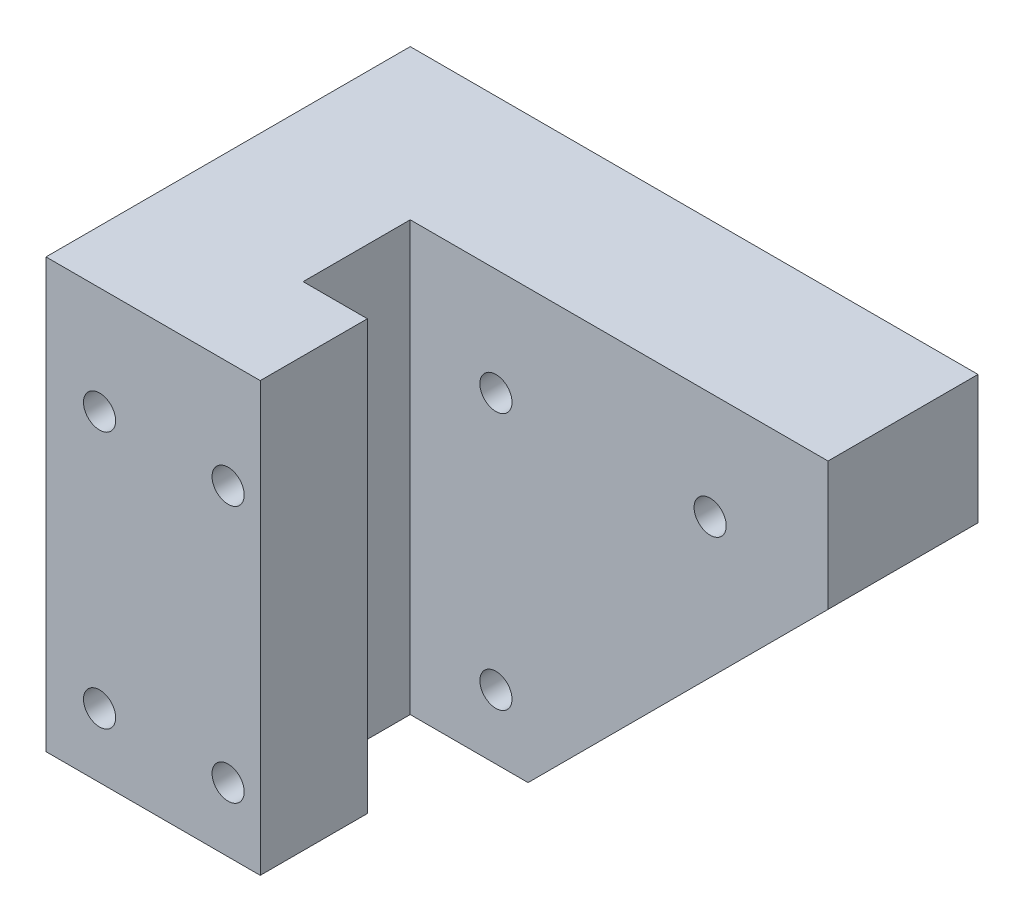
ISO-10303-21;
HEADER;
FILE_DESCRIPTION(('STEP AP214'),'2;1');
FILE_NAME('part.step','',(''),(''),'','','');
FILE_SCHEMA(('AUTOMOTIVE_DESIGN { 1 0 10303 214 1 1 1 1 }'));
ENDSEC;
DATA;
#1=APPLICATION_CONTEXT('core data for automotive mechanical design processes');
#2=APPLICATION_PROTOCOL_DEFINITION('international standard','automotive_design',2000,#1);
#3=PRODUCT_CONTEXT('',#1,'mechanical');
#4=PRODUCT('Part','Part','',(#3));
#5=PRODUCT_RELATED_PRODUCT_CATEGORY('part','',(#4));
#6=PRODUCT_DEFINITION_FORMATION('','',#4);
#7=PRODUCT_DEFINITION_CONTEXT('part definition',#1,'design');
#8=PRODUCT_DEFINITION('design','',#6,#7);
#9=PRODUCT_DEFINITION_SHAPE('','',#8);
#10=(LENGTH_UNIT() NAMED_UNIT(*) SI_UNIT(.MILLI.,.METRE.));
#11=(NAMED_UNIT(*) PLANE_ANGLE_UNIT() SI_UNIT($,.RADIAN.));
#12=(NAMED_UNIT(*) SI_UNIT($,.STERADIAN.) SOLID_ANGLE_UNIT());
#13=UNCERTAINTY_MEASURE_WITH_UNIT(LENGTH_MEASURE(1.E-05),#10,'distance_accuracy_value','');
#14=(GEOMETRIC_REPRESENTATION_CONTEXT(3) GLOBAL_UNCERTAINTY_ASSIGNED_CONTEXT((#13)) GLOBAL_UNIT_ASSIGNED_CONTEXT((#10,
#11,#12)) REPRESENTATION_CONTEXT('',''));
#15=CARTESIAN_POINT('',(0.,0.,0.));
#16=DIRECTION('',(0.,0.,1.));
#17=DIRECTION('',(1.,0.,0.));
#18=AXIS2_PLACEMENT_3D('',#15,#16,#17);
#19=CARTESIAN_POINT('',(20.,0.,34.));
#20=DIRECTION('',(-1.,0.,0.));
#21=DIRECTION('',(0.,0.,1.));
#22=AXIS2_PLACEMENT_3D('',#19,#20,#21);
#23=PLANE('',#22);
#24=DIRECTION('',(0.,-1.,0.));
#25=VECTOR('',#24,1.);
#26=CARTESIAN_POINT('',(20.,40.,24.));
#27=LINE('',#26,#25);
#28=CARTESIAN_POINT('',(20.,40.,24.));
#29=VERTEX_POINT('',#28);
#30=CARTESIAN_POINT('',(20.,0.,24.));
#31=VERTEX_POINT('',#30);
#32=EDGE_CURVE('E117',#29,#31,#27,.T.);
#33=ORIENTED_EDGE('',*,*,#32,.F.);
#34=DIRECTION('',(0.,0.,-1.));
#35=VECTOR('',#34,1.);
#36=CARTESIAN_POINT('',(20.,40.,34.));
#37=LINE('',#36,#35);
#38=CARTESIAN_POINT('',(20.,40.,34.));
#39=VERTEX_POINT('',#38);
#40=EDGE_CURVE('E132',#39,#29,#37,.T.);
#41=ORIENTED_EDGE('',*,*,#40,.F.);
#42=DIRECTION('',(0.,1.,0.));
#43=VECTOR('',#42,1.);
#44=CARTESIAN_POINT('',(20.,0.,34.));
#45=LINE('',#44,#43);
#46=CARTESIAN_POINT('',(20.,0.,34.));
#47=VERTEX_POINT('',#46);
#48=EDGE_CURVE('E198',#47,#39,#45,.T.);
#49=ORIENTED_EDGE('',*,*,#48,.F.);
#50=DIRECTION('',(0.,0.,-1.));
#51=VECTOR('',#50,1.);
#52=CARTESIAN_POINT('',(20.,0.,34.));
#53=LINE('',#52,#51);
#54=EDGE_CURVE('E135',#47,#31,#53,.T.);
#55=ORIENTED_EDGE('',*,*,#54,.T.);
#56=EDGE_LOOP('',(#33,#41,#49,#55));
#57=FACE_BOUND('',#56,.T.);
#58=ADVANCED_FACE('F41',(#57),#23,.F.);
#59=CARTESIAN_POINT('',(0.,0.,34.));
#60=DIRECTION('',(0.,1.,0.));
#61=DIRECTION('',(0.,0.,1.));
#62=AXIS2_PLACEMENT_3D('',#59,#60,#61);
#63=PLANE('',#62);
#64=DIRECTION('',(-1.,0.,0.));
#65=VECTOR('',#64,1.);
#66=CARTESIAN_POINT('',(20.,0.,24.));
#67=LINE('',#66,#65);
#68=CARTESIAN_POINT('',(14.,0.,24.));
#69=VERTEX_POINT('',#68);
#70=EDGE_CURVE('E396',#31,#69,#67,.T.);
#71=ORIENTED_EDGE('',*,*,#70,.F.);
#72=ORIENTED_EDGE('',*,*,#54,.F.);
#73=DIRECTION('',(1.,0.,0.));
#74=VECTOR('',#73,1.);
#75=CARTESIAN_POINT('',(0.,0.,34.));
#76=LINE('',#75,#74);
#77=CARTESIAN_POINT('',(0.,0.,34.));
#78=VERTEX_POINT('',#77);
#79=EDGE_CURVE('E196',#78,#47,#76,.T.);
#80=ORIENTED_EDGE('',*,*,#79,.F.);
#81=DIRECTION('',(0.,0.,-1.));
#82=VECTOR('',#81,1.);
#83=CARTESIAN_POINT('',(0.,0.,34.));
#84=LINE('',#83,#82);
#85=CARTESIAN_POINT('',(0.,0.,0.));
#86=VERTEX_POINT('',#85);
#87=EDGE_CURVE('E49',#78,#86,#84,.T.);
#88=ORIENTED_EDGE('',*,*,#87,.T.);
#89=DIRECTION('',(1.,0.,0.));
#90=VECTOR('',#89,1.);
#91=CARTESIAN_POINT('',(0.,0.,0.));
#92=LINE('',#91,#90);
#93=CARTESIAN_POINT('',(25.,0.,0.));
#94=VERTEX_POINT('',#93);
#95=EDGE_CURVE('E202',#86,#94,#92,.T.);
#96=ORIENTED_EDGE('',*,*,#95,.T.);
#97=DIRECTION('',(0.,0.,-1.));
#98=VECTOR('',#97,1.);
#99=CARTESIAN_POINT('',(25.,0.,34.));
#100=LINE('',#99,#98);
#101=CARTESIAN_POINT('',(25.,0.,14.));
#102=VERTEX_POINT('',#101);
#103=EDGE_CURVE('E162',#102,#94,#100,.T.);
#104=ORIENTED_EDGE('',*,*,#103,.F.);
#105=DIRECTION('',(-1.,0.,0.));
#106=VECTOR('',#105,1.);
#107=CARTESIAN_POINT('',(0.,0.,14.));
#108=LINE('',#107,#106);
#109=CARTESIAN_POINT('',(14.,0.,14.));
#110=VERTEX_POINT('',#109);
#111=EDGE_CURVE('E175',#102,#110,#108,.T.);
#112=ORIENTED_EDGE('',*,*,#111,.T.);
#113=DIRECTION('',(0.,0.,-1.));
#114=VECTOR('',#113,1.);
#115=CARTESIAN_POINT('',(14.,0.,14.));
#116=LINE('',#115,#114);
#117=EDGE_CURVE('E129',#69,#110,#116,.T.);
#118=ORIENTED_EDGE('',*,*,#117,.F.);
#119=EDGE_LOOP('',(#71,#72,#80,#88,#96,#104,#112,#118));
#120=FACE_BOUND('',#119,.T.);
#121=ADVANCED_FACE('F216',(#120),#63,.F.);
#122=CARTESIAN_POINT('',(53.,0.,14.));
#123=DIRECTION('',(1.,0.,0.));
#124=DIRECTION('',(0.,0.,-1.));
#125=AXIS2_PLACEMENT_3D('',#122,#123,#124);
#126=PLANE('',#125);
#127=DIRECTION('',(0.,-1.,0.));
#128=VECTOR('',#127,1.);
#129=CARTESIAN_POINT('',(53.,0.,14.));
#130=LINE('',#129,#128);
#131=CARTESIAN_POINT('',(53.,40.,14.));
#132=VERTEX_POINT('',#131);
#133=CARTESIAN_POINT('',(53.,28.,14.));
#134=VERTEX_POINT('',#133);
#135=EDGE_CURVE('E169',#132,#134,#130,.T.);
#136=ORIENTED_EDGE('',*,*,#135,.T.);
#137=DIRECTION('',(0.,0.,-1.));
#138=VECTOR('',#137,1.);
#139=CARTESIAN_POINT('',(53.,28.,34.));
#140=LINE('',#139,#138);
#141=CARTESIAN_POINT('',(53.,28.,0.));
#142=VERTEX_POINT('',#141);
#143=EDGE_CURVE('E66',#134,#142,#140,.T.);
#144=ORIENTED_EDGE('',*,*,#143,.T.);
#145=DIRECTION('',(0.,-1.,0.));
#146=VECTOR('',#145,1.);
#147=CARTESIAN_POINT('',(53.,0.,0.));
#148=LINE('',#147,#146);
#149=CARTESIAN_POINT('',(53.,40.,0.));
#150=VERTEX_POINT('',#149);
#151=EDGE_CURVE('E170',#150,#142,#148,.T.);
#152=ORIENTED_EDGE('',*,*,#151,.F.);
#153=DIRECTION('',(0.,0.,-1.));
#154=VECTOR('',#153,1.);
#155=CARTESIAN_POINT('',(53.,40.,14.));
#156=LINE('',#155,#154);
#157=EDGE_CURVE('E174',#132,#150,#156,.T.);
#158=ORIENTED_EDGE('',*,*,#157,.F.);
#159=EDGE_LOOP('',(#136,#144,#152,#158));
#160=FACE_BOUND('',#159,.T.);
#161=ADVANCED_FACE('F241',(#160),#126,.T.);
#162=CARTESIAN_POINT('',(0.,0.,34.));
#163=DIRECTION('',(1.,0.,0.));
#164=DIRECTION('',(0.,0.,-1.));
#165=AXIS2_PLACEMENT_3D('',#162,#163,#164);
#166=PLANE('',#165);
#167=DIRECTION('',(0.,-1.,0.));
#168=VECTOR('',#167,1.);
#169=CARTESIAN_POINT('',(0.,0.,0.));
#170=LINE('',#169,#168);
#171=CARTESIAN_POINT('',(0.,40.,0.));
#172=VERTEX_POINT('',#171);
#173=EDGE_CURVE('E183',#172,#86,#170,.T.);
#174=ORIENTED_EDGE('',*,*,#173,.T.);
#175=ORIENTED_EDGE('',*,*,#87,.F.);
#176=DIRECTION('',(0.,-1.,0.));
#177=VECTOR('',#176,1.);
#178=CARTESIAN_POINT('',(0.,0.,34.));
#179=LINE('',#178,#177);
#180=CARTESIAN_POINT('',(0.,40.,34.));
#181=VERTEX_POINT('',#180);
#182=EDGE_CURVE('E195',#181,#78,#179,.T.);
#183=ORIENTED_EDGE('',*,*,#182,.F.);
#184=DIRECTION('',(0.,0.,-1.));
#185=VECTOR('',#184,1.);
#186=CARTESIAN_POINT('',(0.,40.,34.));
#187=LINE('',#186,#185);
#188=EDGE_CURVE('E139',#181,#172,#187,.T.);
#189=ORIENTED_EDGE('',*,*,#188,.T.);
#190=EDGE_LOOP('',(#174,#175,#183,#189));
#191=FACE_BOUND('',#190,.T.);
#192=ADVANCED_FACE('F43',(#191),#166,.F.);
#193=CARTESIAN_POINT('',(0.,40.,34.));
#194=DIRECTION('',(0.,-1.,0.));
#195=DIRECTION('',(0.,0.,-1.));
#196=AXIS2_PLACEMENT_3D('',#193,#194,#195);
#197=PLANE('',#196);
#198=DIRECTION('',(0.,0.,-1.));
#199=VECTOR('',#198,1.);
#200=CARTESIAN_POINT('',(14.,40.,14.));
#201=LINE('',#200,#199);
#202=CARTESIAN_POINT('',(14.,40.,24.));
#203=VERTEX_POINT('',#202);
#204=CARTESIAN_POINT('',(14.,40.,14.));
#205=VERTEX_POINT('',#204);
#206=EDGE_CURVE('E123',#203,#205,#201,.T.);
#207=ORIENTED_EDGE('',*,*,#206,.T.);
#208=DIRECTION('',(1.,0.,0.));
#209=VECTOR('',#208,1.);
#210=CARTESIAN_POINT('',(0.,40.,14.));
#211=LINE('',#210,#209);
#212=EDGE_CURVE('E59',#205,#132,#211,.T.);
#213=ORIENTED_EDGE('',*,*,#212,.T.);
#214=ORIENTED_EDGE('',*,*,#157,.T.);
#215=DIRECTION('',(-1.,0.,0.));
#216=VECTOR('',#215,1.);
#217=CARTESIAN_POINT('',(0.,40.,0.));
#218=LINE('',#217,#216);
#219=EDGE_CURVE('E197',#150,#172,#218,.T.);
#220=ORIENTED_EDGE('',*,*,#219,.T.);
#221=ORIENTED_EDGE('',*,*,#188,.F.);
#222=DIRECTION('',(-1.,0.,0.));
#223=VECTOR('',#222,1.);
#224=CARTESIAN_POINT('',(0.,40.,34.));
#225=LINE('',#224,#223);
#226=EDGE_CURVE('E137',#39,#181,#225,.T.);
#227=ORIENTED_EDGE('',*,*,#226,.F.);
#228=ORIENTED_EDGE('',*,*,#40,.T.);
#229=DIRECTION('',(-1.,0.,0.));
#230=VECTOR('',#229,1.);
#231=CARTESIAN_POINT('',(20.,40.,24.));
#232=LINE('',#231,#230);
#233=EDGE_CURVE('E112',#29,#203,#232,.T.);
#234=ORIENTED_EDGE('',*,*,#233,.T.);
#235=EDGE_LOOP('',(#207,#213,#214,#220,#221,#227,#228,#234));
#236=FACE_BOUND('',#235,.T.);
#237=ADVANCED_FACE('F140',(#236),#197,.F.);
#238=CARTESIAN_POINT('',(0.,0.,34.));
#239=DIRECTION('',(0.,0.,-1.));
#240=DIRECTION('',(-1.,0.,0.));
#241=AXIS2_PLACEMENT_3D('',#238,#239,#240);
#242=PLANE('',#241);
#243=CARTESIAN_POINT('',(17.,30.,34.));
#244=DIRECTION('',(0.,0.,1.));
#245=DIRECTION('',(1.,0.,0.));
#246=AXIS2_PLACEMENT_3D('',#243,#244,#245);
#247=CIRCLE('',#246,1.5);
#248=CARTESIAN_POINT('',(18.5,30.,34.));
#249=VERTEX_POINT('',#248);
#250=EDGE_CURVE('E395',#249,#249,#247,.T.);
#251=ORIENTED_EDGE('',*,*,#250,.F.);
#252=EDGE_LOOP('',(#251));
#253=FACE_BOUND('',#252,.T.);
#254=CARTESIAN_POINT('',(17.,6.,34.));
#255=DIRECTION('',(0.,0.,1.));
#256=DIRECTION('',(1.,0.,0.));
#257=AXIS2_PLACEMENT_3D('',#254,#255,#256);
#258=CIRCLE('',#257,1.5);
#259=CARTESIAN_POINT('',(18.5,6.,34.));
#260=VERTEX_POINT('',#259);
#261=EDGE_CURVE('E398',#260,#260,#258,.T.);
#262=ORIENTED_EDGE('',*,*,#261,.F.);
#263=EDGE_LOOP('',(#262));
#264=FACE_BOUND('',#263,.T.);
#265=CARTESIAN_POINT('',(5.,30.,34.));
#266=DIRECTION('',(0.,0.,1.));
#267=DIRECTION('',(1.,0.,0.));
#268=AXIS2_PLACEMENT_3D('',#265,#266,#267);
#269=CIRCLE('',#268,1.5);
#270=CARTESIAN_POINT('',(6.5,30.,34.));
#271=VERTEX_POINT('',#270);
#272=EDGE_CURVE('E184',#271,#271,#269,.T.);
#273=ORIENTED_EDGE('',*,*,#272,.F.);
#274=EDGE_LOOP('',(#273));
#275=FACE_BOUND('',#274,.T.);
#276=CARTESIAN_POINT('',(5.,6.,34.));
#277=DIRECTION('',(0.,0.,1.));
#278=DIRECTION('',(1.,0.,0.));
#279=AXIS2_PLACEMENT_3D('',#276,#277,#278);
#280=CIRCLE('',#279,1.5);
#281=CARTESIAN_POINT('',(6.5,6.,34.));
#282=VERTEX_POINT('',#281);
#283=EDGE_CURVE('E189',#282,#282,#280,.T.);
#284=ORIENTED_EDGE('',*,*,#283,.F.);
#285=EDGE_LOOP('',(#284));
#286=FACE_BOUND('',#285,.T.);
#287=ORIENTED_EDGE('',*,*,#182,.T.);
#288=ORIENTED_EDGE('',*,*,#79,.T.);
#289=ORIENTED_EDGE('',*,*,#48,.T.);
#290=ORIENTED_EDGE('',*,*,#226,.T.);
#291=EDGE_LOOP('',(#287,#288,#289,#290));
#292=FACE_BOUND('',#291,.T.);
#293=ADVANCED_FACE('F219',(#253,#264,#275,#286,#292),#242,.F.);
#294=CARTESIAN_POINT('',(0.,0.,0.));
#295=DIRECTION('',(0.,0.,-1.));
#296=DIRECTION('',(-1.,0.,0.));
#297=AXIS2_PLACEMENT_3D('',#294,#295,#296);
#298=PLANE('',#297);
#299=CARTESIAN_POINT('',(42.,30.,0.));
#300=DIRECTION('',(0.,0.,-1.));
#301=DIRECTION('',(-1.,0.,0.));
#302=AXIS2_PLACEMENT_3D('',#299,#300,#301);
#303=CIRCLE('',#302,1.5);
#304=CARTESIAN_POINT('',(40.5,30.,0.));
#305=VERTEX_POINT('',#304);
#306=EDGE_CURVE('E412',#305,#305,#303,.T.);
#307=ORIENTED_EDGE('',*,*,#306,.F.);
#308=EDGE_LOOP('',(#307));
#309=FACE_BOUND('',#308,.T.);
#310=CARTESIAN_POINT('',(22.,6.,0.));
#311=DIRECTION('',(0.,0.,-1.));
#312=DIRECTION('',(-1.,0.,0.));
#313=AXIS2_PLACEMENT_3D('',#310,#311,#312);
#314=CIRCLE('',#313,1.5);
#315=CARTESIAN_POINT('',(20.5,6.,0.));
#316=VERTEX_POINT('',#315);
#317=EDGE_CURVE('E413',#316,#316,#314,.T.);
#318=ORIENTED_EDGE('',*,*,#317,.F.);
#319=EDGE_LOOP('',(#318));
#320=FACE_BOUND('',#319,.T.);
#321=CARTESIAN_POINT('',(22.,30.,0.));
#322=DIRECTION('',(0.,0.,-1.));
#323=DIRECTION('',(-1.,0.,0.));
#324=AXIS2_PLACEMENT_3D('',#321,#322,#323);
#325=CIRCLE('',#324,1.5);
#326=CARTESIAN_POINT('',(20.5,30.,0.));
#327=VERTEX_POINT('',#326);
#328=EDGE_CURVE('E152',#327,#327,#325,.T.);
#329=ORIENTED_EDGE('',*,*,#328,.F.);
#330=EDGE_LOOP('',(#329));
#331=FACE_BOUND('',#330,.T.);
#332=DIRECTION('',(0.707106781186547,0.707106781186547,0.));
#333=VECTOR('',#332,1.);
#334=CARTESIAN_POINT('',(53.,28.,0.));
#335=LINE('',#334,#333);
#336=EDGE_CURVE('E160',#94,#142,#335,.T.);
#337=ORIENTED_EDGE('',*,*,#336,.F.);
#338=ORIENTED_EDGE('',*,*,#95,.F.);
#339=ORIENTED_EDGE('',*,*,#173,.F.);
#340=ORIENTED_EDGE('',*,*,#219,.F.);
#341=ORIENTED_EDGE('',*,*,#151,.T.);
#342=EDGE_LOOP('',(#337,#338,#339,#340,#341));
#343=FACE_BOUND('',#342,.T.);
#344=CARTESIAN_POINT('',(5.,30.,0.));
#345=DIRECTION('',(0.,0.,1.));
#346=DIRECTION('',(1.,0.,0.));
#347=AXIS2_PLACEMENT_3D('',#344,#345,#346);
#348=CIRCLE('',#347,1.5);
#349=CARTESIAN_POINT('',(6.5,30.,0.));
#350=VERTEX_POINT('',#349);
#351=EDGE_CURVE('E181',#350,#350,#348,.T.);
#352=ORIENTED_EDGE('',*,*,#351,.T.);
#353=EDGE_LOOP('',(#352));
#354=FACE_BOUND('',#353,.T.);
#355=CARTESIAN_POINT('',(5.,6.,0.));
#356=DIRECTION('',(0.,0.,1.));
#357=DIRECTION('',(1.,0.,0.));
#358=AXIS2_PLACEMENT_3D('',#355,#356,#357);
#359=CIRCLE('',#358,1.5);
#360=CARTESIAN_POINT('',(6.5,6.,0.));
#361=VERTEX_POINT('',#360);
#362=EDGE_CURVE('E179',#361,#361,#359,.T.);
#363=ORIENTED_EDGE('',*,*,#362,.T.);
#364=EDGE_LOOP('',(#363));
#365=FACE_BOUND('',#364,.T.);
#366=ADVANCED_FACE('F211',(#309,#320,#331,#343,#354,#365),#298,.T.);
#367=CARTESIAN_POINT('',(5.,6.,0.));
#368=DIRECTION('',(0.,0.,1.));
#369=DIRECTION('',(1.,0.,0.));
#370=AXIS2_PLACEMENT_3D('',#367,#368,#369);
#371=CYLINDRICAL_SURFACE('',#370,1.5);
#372=ORIENTED_EDGE('',*,*,#362,.F.);
#373=EDGE_LOOP('',(#372));
#374=FACE_BOUND('',#373,.T.);
#375=ORIENTED_EDGE('',*,*,#283,.T.);
#376=EDGE_LOOP('',(#375));
#377=FACE_BOUND('',#376,.T.);
#378=ADVANCED_FACE('F227',(#374,#377),#371,.F.);
#379=CARTESIAN_POINT('',(5.,30.,0.));
#380=DIRECTION('',(0.,0.,1.));
#381=DIRECTION('',(1.,0.,0.));
#382=AXIS2_PLACEMENT_3D('',#379,#380,#381);
#383=CYLINDRICAL_SURFACE('',#382,1.5);
#384=ORIENTED_EDGE('',*,*,#351,.F.);
#385=EDGE_LOOP('',(#384));
#386=FACE_BOUND('',#385,.T.);
#387=ORIENTED_EDGE('',*,*,#272,.T.);
#388=EDGE_LOOP('',(#387));
#389=FACE_BOUND('',#388,.T.);
#390=ADVANCED_FACE('F259',(#386,#389),#383,.F.);
#391=CARTESIAN_POINT('',(0.,0.,14.));
#392=DIRECTION('',(0.,0.,-1.));
#393=DIRECTION('',(-1.,0.,0.));
#394=AXIS2_PLACEMENT_3D('',#391,#392,#393);
#395=PLANE('',#394);
#396=CARTESIAN_POINT('',(42.,30.,14.));
#397=DIRECTION('',(0.,0.,-1.));
#398=DIRECTION('',(-1.,0.,0.));
#399=AXIS2_PLACEMENT_3D('',#396,#397,#398);
#400=CIRCLE('',#399,1.5);
#401=CARTESIAN_POINT('',(40.5,30.,14.));
#402=VERTEX_POINT('',#401);
#403=EDGE_CURVE('E44',#402,#402,#400,.T.);
#404=ORIENTED_EDGE('',*,*,#403,.T.);
#405=EDGE_LOOP('',(#404));
#406=FACE_BOUND('',#405,.T.);
#407=CARTESIAN_POINT('',(22.,6.,14.));
#408=DIRECTION('',(0.,0.,-1.));
#409=DIRECTION('',(-1.,0.,0.));
#410=AXIS2_PLACEMENT_3D('',#407,#408,#409);
#411=CIRCLE('',#410,1.5);
#412=CARTESIAN_POINT('',(20.5,6.,14.));
#413=VERTEX_POINT('',#412);
#414=EDGE_CURVE('E151',#413,#413,#411,.T.);
#415=ORIENTED_EDGE('',*,*,#414,.T.);
#416=EDGE_LOOP('',(#415));
#417=FACE_BOUND('',#416,.T.);
#418=CARTESIAN_POINT('',(22.,30.,14.));
#419=DIRECTION('',(0.,0.,-1.));
#420=DIRECTION('',(-1.,0.,0.));
#421=AXIS2_PLACEMENT_3D('',#418,#419,#420);
#422=CIRCLE('',#421,1.5);
#423=CARTESIAN_POINT('',(20.5,30.,14.));
#424=VERTEX_POINT('',#423);
#425=EDGE_CURVE('E148',#424,#424,#422,.T.);
#426=ORIENTED_EDGE('',*,*,#425,.T.);
#427=EDGE_LOOP('',(#426));
#428=FACE_BOUND('',#427,.T.);
#429=ORIENTED_EDGE('',*,*,#111,.F.);
#430=DIRECTION('',(0.707106781186548,0.707106781186548,0.));
#431=VECTOR('',#430,1.);
#432=CARTESIAN_POINT('',(12.5,-12.5,14.));
#433=LINE('',#432,#431);
#434=EDGE_CURVE('E11',#102,#134,#433,.T.);
#435=ORIENTED_EDGE('',*,*,#434,.T.);
#436=ORIENTED_EDGE('',*,*,#135,.F.);
#437=ORIENTED_EDGE('',*,*,#212,.F.);
#438=DIRECTION('',(0.,-1.,0.));
#439=VECTOR('',#438,1.);
#440=CARTESIAN_POINT('',(14.,40.,14.));
#441=LINE('',#440,#439);
#442=EDGE_CURVE('E407',#205,#110,#441,.T.);
#443=ORIENTED_EDGE('',*,*,#442,.T.);
#444=EDGE_LOOP('',(#429,#435,#436,#437,#443));
#445=FACE_BOUND('',#444,.T.);
#446=ADVANCED_FACE('F251',(#406,#417,#428,#445),#395,.F.);
#447=CARTESIAN_POINT('',(53.,28.,34.));
#448=DIRECTION('',(-0.707106781186547,0.707106781186547,0.));
#449=DIRECTION('',(-0.707106781186548,-0.707106781186548,0.));
#450=AXIS2_PLACEMENT_3D('',#447,#448,#449);
#451=PLANE('',#450);
#452=ORIENTED_EDGE('',*,*,#103,.T.);
#453=ORIENTED_EDGE('',*,*,#336,.T.);
#454=ORIENTED_EDGE('',*,*,#143,.F.);
#455=ORIENTED_EDGE('',*,*,#434,.F.);
#456=EDGE_LOOP('',(#452,#453,#454,#455));
#457=FACE_BOUND('',#456,.T.);
#458=ADVANCED_FACE('F305',(#457),#451,.F.);
#459=CARTESIAN_POINT('',(22.,30.,34.));
#460=DIRECTION('',(0.,0.,-1.));
#461=DIRECTION('',(-1.,0.,0.));
#462=AXIS2_PLACEMENT_3D('',#459,#460,#461);
#463=CYLINDRICAL_SURFACE('',#462,1.5);
#464=ORIENTED_EDGE('',*,*,#328,.T.);
#465=EDGE_LOOP('',(#464));
#466=FACE_BOUND('',#465,.T.);
#467=ORIENTED_EDGE('',*,*,#425,.F.);
#468=EDGE_LOOP('',(#467));
#469=FACE_BOUND('',#468,.T.);
#470=ADVANCED_FACE('F317',(#466,#469),#463,.F.);
#471=CARTESIAN_POINT('',(22.,6.,34.));
#472=DIRECTION('',(0.,0.,-1.));
#473=DIRECTION('',(-1.,0.,0.));
#474=AXIS2_PLACEMENT_3D('',#471,#472,#473);
#475=CYLINDRICAL_SURFACE('',#474,1.5);
#476=ORIENTED_EDGE('',*,*,#317,.T.);
#477=EDGE_LOOP('',(#476));
#478=FACE_BOUND('',#477,.T.);
#479=ORIENTED_EDGE('',*,*,#414,.F.);
#480=EDGE_LOOP('',(#479));
#481=FACE_BOUND('',#480,.T.);
#482=ADVANCED_FACE('F325',(#478,#481),#475,.F.);
#483=CARTESIAN_POINT('',(42.,30.,34.));
#484=DIRECTION('',(0.,0.,-1.));
#485=DIRECTION('',(-1.,0.,0.));
#486=AXIS2_PLACEMENT_3D('',#483,#484,#485);
#487=CYLINDRICAL_SURFACE('',#486,1.5);
#488=ORIENTED_EDGE('',*,*,#306,.T.);
#489=EDGE_LOOP('',(#488));
#490=FACE_BOUND('',#489,.T.);
#491=ORIENTED_EDGE('',*,*,#403,.F.);
#492=EDGE_LOOP('',(#491));
#493=FACE_BOUND('',#492,.T.);
#494=ADVANCED_FACE('F331',(#490,#493),#487,.F.);
#495=CARTESIAN_POINT('',(14.,40.,14.));
#496=DIRECTION('',(-1.,0.,0.));
#497=DIRECTION('',(0.,0.,1.));
#498=AXIS2_PLACEMENT_3D('',#495,#496,#497);
#499=PLANE('',#498);
#500=ORIENTED_EDGE('',*,*,#117,.T.);
#501=ORIENTED_EDGE('',*,*,#442,.F.);
#502=ORIENTED_EDGE('',*,*,#206,.F.);
#503=DIRECTION('',(0.,-1.,0.));
#504=VECTOR('',#503,1.);
#505=CARTESIAN_POINT('',(14.,40.,24.));
#506=LINE('',#505,#504);
#507=EDGE_CURVE('E119',#203,#69,#506,.T.);
#508=ORIENTED_EDGE('',*,*,#507,.T.);
#509=EDGE_LOOP('',(#500,#501,#502,#508));
#510=FACE_BOUND('',#509,.T.);
#511=ADVANCED_FACE('F341',(#510),#499,.F.);
#512=CARTESIAN_POINT('',(20.,40.,24.));
#513=DIRECTION('',(0.,0.,1.));
#514=DIRECTION('',(1.,0.,0.));
#515=AXIS2_PLACEMENT_3D('',#512,#513,#514);
#516=PLANE('',#515);
#517=CARTESIAN_POINT('',(17.,30.,24.));
#518=DIRECTION('',(0.,0.,1.));
#519=DIRECTION('',(1.,0.,0.));
#520=AXIS2_PLACEMENT_3D('',#517,#518,#519);
#521=CIRCLE('',#520,1.5);
#522=CARTESIAN_POINT('',(18.5,30.,24.));
#523=VERTEX_POINT('',#522);
#524=EDGE_CURVE('E394',#523,#523,#521,.F.);
#525=ORIENTED_EDGE('',*,*,#524,.F.);
#526=EDGE_LOOP('',(#525));
#527=FACE_BOUND('',#526,.T.);
#528=CARTESIAN_POINT('',(17.,6.,24.));
#529=DIRECTION('',(0.,0.,1.));
#530=DIRECTION('',(1.,0.,0.));
#531=AXIS2_PLACEMENT_3D('',#528,#529,#530);
#532=CIRCLE('',#531,1.5);
#533=CARTESIAN_POINT('',(18.5,6.,24.));
#534=VERTEX_POINT('',#533);
#535=EDGE_CURVE('E402',#534,#534,#532,.F.);
#536=ORIENTED_EDGE('',*,*,#535,.F.);
#537=EDGE_LOOP('',(#536));
#538=FACE_BOUND('',#537,.T.);
#539=ORIENTED_EDGE('',*,*,#70,.T.);
#540=ORIENTED_EDGE('',*,*,#507,.F.);
#541=ORIENTED_EDGE('',*,*,#233,.F.);
#542=ORIENTED_EDGE('',*,*,#32,.T.);
#543=EDGE_LOOP('',(#539,#540,#541,#542));
#544=FACE_BOUND('',#543,.T.);
#545=ADVANCED_FACE('F120',(#527,#538,#544),#516,.F.);
#546=CARTESIAN_POINT('',(17.,6.,19.7573593128807));
#547=DIRECTION('',(0.,0.,1.));
#548=DIRECTION('',(1.,0.,0.));
#549=AXIS2_PLACEMENT_3D('',#546,#547,#548);
#550=CYLINDRICAL_SURFACE('',#549,1.5);
#551=CARTESIAN_POINT('',(18.5,6.,24.));
#552=CARTESIAN_POINT('',(18.5,6.,24.1041666666667));
#553=CARTESIAN_POINT('',(18.5,6.,24.2083333333333));
#554=CARTESIAN_POINT('',(18.5,6.,24.4166666666667));
#555=CARTESIAN_POINT('',(18.5,6.,24.5208333333333));
#556=CARTESIAN_POINT('',(18.5,6.,24.7291666666667));
#557=CARTESIAN_POINT('',(18.5,6.,24.8333333333333));
#558=CARTESIAN_POINT('',(18.5,6.,25.0416666666667));
#559=CARTESIAN_POINT('',(18.5,6.,25.1458333333333));
#560=CARTESIAN_POINT('',(18.5,6.,25.3541666666667));
#561=CARTESIAN_POINT('',(18.5,6.,25.4583333333333));
#562=CARTESIAN_POINT('',(18.5,6.,25.6666666666667));
#563=CARTESIAN_POINT('',(18.5,6.,25.7708333333333));
#564=CARTESIAN_POINT('',(18.5,6.,25.9791666666667));
#565=CARTESIAN_POINT('',(18.5,6.,26.0833333333333));
#566=CARTESIAN_POINT('',(18.5,6.,26.2916666666667));
#567=CARTESIAN_POINT('',(18.5,6.,26.3958333333333));
#568=CARTESIAN_POINT('',(18.5,6.,26.6041666666667));
#569=CARTESIAN_POINT('',(18.5,6.,26.7083333333333));
#570=CARTESIAN_POINT('',(18.5,6.,26.9166666666667));
#571=CARTESIAN_POINT('',(18.5,6.,27.0208333333333));
#572=CARTESIAN_POINT('',(18.5,6.,27.2291666666667));
#573=CARTESIAN_POINT('',(18.5,6.,27.3333333333333));
#574=CARTESIAN_POINT('',(18.5,6.,27.5416666666667));
#575=CARTESIAN_POINT('',(18.5,6.,27.6458333333333));
#576=CARTESIAN_POINT('',(18.5,6.,27.8541666666667));
#577=CARTESIAN_POINT('',(18.5,6.,27.9583333333333));
#578=CARTESIAN_POINT('',(18.5,6.,28.1666666666667));
#579=CARTESIAN_POINT('',(18.5,6.,28.2708333333333));
#580=CARTESIAN_POINT('',(18.5,6.,28.4791666666667));
#581=CARTESIAN_POINT('',(18.5,6.,28.5833333333333));
#582=CARTESIAN_POINT('',(18.5,6.,28.7916666666667));
#583=CARTESIAN_POINT('',(18.5,6.,28.8958333333333));
#584=CARTESIAN_POINT('',(18.5,6.,29.1041666666667));
#585=CARTESIAN_POINT('',(18.5,6.,29.2083333333333));
#586=CARTESIAN_POINT('',(18.5,6.,29.4166666666667));
#587=CARTESIAN_POINT('',(18.5,6.,29.5208333333333));
#588=CARTESIAN_POINT('',(18.5,6.,29.7291666666667));
#589=CARTESIAN_POINT('',(18.5,6.,29.8333333333333));
#590=CARTESIAN_POINT('',(18.5,6.,30.0416666666667));
#591=CARTESIAN_POINT('',(18.5,6.,30.1458333333333));
#592=CARTESIAN_POINT('',(18.5,6.,30.3541666666667));
#593=CARTESIAN_POINT('',(18.5,6.,30.4583333333333));
#594=CARTESIAN_POINT('',(18.5,6.,30.6666666666667));
#595=CARTESIAN_POINT('',(18.5,6.,30.7708333333333));
#596=CARTESIAN_POINT('',(18.5,6.,30.9791666666667));
#597=CARTESIAN_POINT('',(18.5,6.,31.0833333333333));
#598=CARTESIAN_POINT('',(18.5,6.,31.2916666666667));
#599=CARTESIAN_POINT('',(18.5,6.,31.3958333333333));
#600=CARTESIAN_POINT('',(18.5,6.,31.6041666666667));
#601=CARTESIAN_POINT('',(18.5,6.,31.7083333333333));
#602=CARTESIAN_POINT('',(18.5,6.,31.9166666666667));
#603=CARTESIAN_POINT('',(18.5,6.,32.0208333333333));
#604=CARTESIAN_POINT('',(18.5,6.,32.2291666666667));
#605=CARTESIAN_POINT('',(18.5,6.,32.3333333333333));
#606=CARTESIAN_POINT('',(18.5,6.,32.5416666666667));
#607=CARTESIAN_POINT('',(18.5,6.,32.6458333333333));
#608=CARTESIAN_POINT('',(18.5,6.,32.8541666666667));
#609=CARTESIAN_POINT('',(18.5,6.,32.9583333333333));
#610=CARTESIAN_POINT('',(18.5,6.,33.1666666666667));
#611=CARTESIAN_POINT('',(18.5,6.,33.2708333333333));
#612=CARTESIAN_POINT('',(18.5,6.,33.4791666666667));
#613=CARTESIAN_POINT('',(18.5,6.,33.5833333333333));
#614=CARTESIAN_POINT('',(18.5,6.,33.7916666666667));
#615=CARTESIAN_POINT('',(18.5,6.,33.8958333333333));
#616=CARTESIAN_POINT('',(18.5,6.,34.));
#617=B_SPLINE_CURVE_WITH_KNOTS('',3,(#551,#552,#553,#554,#555,#556,#557,#558,#559,#560,#561,
#562,#563,#564,#565,#566,#567,#568,#569,#570,#571,#572,#573,#574,#575,#576,#577,#578,#579,#580,
#581,#582,#583,#584,#585,#586,#587,#588,#589,#590,#591,#592,#593,#594,#595,#596,#597,#598,#599,
#600,#601,#602,#603,#604,#605,#606,#607,#608,#609,#610,#611,#612,#613,#614,#615,#616),
.UNSPECIFIED.,.F.,.F.,(4,2,2,2,2,2,2,2,2,2,2,2,2,2,2,2,2,2,2,2,2,2,2,2,2,2,2,2,2,2,2,2,4),(0.,
0.3125,0.625000000000001,0.937500000000001,1.25,1.5625,1.875,2.1875,2.5,2.8125,3.125,3.4375,
3.75,4.0625,4.375,4.6875,5.,5.3125,5.625,5.9375,6.25,6.5625,6.875,7.1875,7.5,7.8125,8.125,
8.4375,8.75,9.0625,9.375,9.6875,10.),.UNSPECIFIED.);
#618=EDGE_CURVE('BSEAM366',#534,#260,#617,.T.);
#619=ORIENTED_EDGE('',*,*,#535,.T.);
#620=ORIENTED_EDGE('',*,*,#261,.T.);
#621=ORIENTED_EDGE('',*,*,#618,.T.);
#622=ORIENTED_EDGE('',*,*,#618,.F.);
#623=EDGE_LOOP('',(#619,#621,#620,#622));
#624=FACE_BOUND('',#623,.T.);
#625=ADVANCED_FACE('F366',(#624),#550,.F.);
#626=CARTESIAN_POINT('',(17.,30.,19.7573593128807));
#627=DIRECTION('',(0.,0.,1.));
#628=DIRECTION('',(1.,0.,0.));
#629=AXIS2_PLACEMENT_3D('',#626,#627,#628);
#630=CYLINDRICAL_SURFACE('',#629,1.5);
#631=CARTESIAN_POINT('',(18.5,30.,24.));
#632=CARTESIAN_POINT('',(18.5,30.,24.1041666666667));
#633=CARTESIAN_POINT('',(18.5,30.,24.2083333333333));
#634=CARTESIAN_POINT('',(18.5,30.,24.4166666666667));
#635=CARTESIAN_POINT('',(18.5,30.,24.5208333333333));
#636=CARTESIAN_POINT('',(18.5,30.,24.7291666666667));
#637=CARTESIAN_POINT('',(18.5,30.,24.8333333333333));
#638=CARTESIAN_POINT('',(18.5,30.,25.0416666666667));
#639=CARTESIAN_POINT('',(18.5,30.,25.1458333333333));
#640=CARTESIAN_POINT('',(18.5,30.,25.3541666666667));
#641=CARTESIAN_POINT('',(18.5,30.,25.4583333333333));
#642=CARTESIAN_POINT('',(18.5,30.,25.6666666666667));
#643=CARTESIAN_POINT('',(18.5,30.,25.7708333333333));
#644=CARTESIAN_POINT('',(18.5,30.,25.9791666666667));
#645=CARTESIAN_POINT('',(18.5,30.,26.0833333333333));
#646=CARTESIAN_POINT('',(18.5,30.,26.2916666666667));
#647=CARTESIAN_POINT('',(18.5,30.,26.3958333333333));
#648=CARTESIAN_POINT('',(18.5,30.,26.6041666666667));
#649=CARTESIAN_POINT('',(18.5,30.,26.7083333333333));
#650=CARTESIAN_POINT('',(18.5,30.,26.9166666666667));
#651=CARTESIAN_POINT('',(18.5,30.,27.0208333333333));
#652=CARTESIAN_POINT('',(18.5,30.,27.2291666666667));
#653=CARTESIAN_POINT('',(18.5,30.,27.3333333333333));
#654=CARTESIAN_POINT('',(18.5,30.,27.5416666666667));
#655=CARTESIAN_POINT('',(18.5,30.,27.6458333333333));
#656=CARTESIAN_POINT('',(18.5,30.,27.8541666666667));
#657=CARTESIAN_POINT('',(18.5,30.,27.9583333333333));
#658=CARTESIAN_POINT('',(18.5,30.,28.1666666666667));
#659=CARTESIAN_POINT('',(18.5,30.,28.2708333333333));
#660=CARTESIAN_POINT('',(18.5,30.,28.4791666666667));
#661=CARTESIAN_POINT('',(18.5,30.,28.5833333333333));
#662=CARTESIAN_POINT('',(18.5,30.,28.7916666666667));
#663=CARTESIAN_POINT('',(18.5,30.,28.8958333333333));
#664=CARTESIAN_POINT('',(18.5,30.,29.1041666666667));
#665=CARTESIAN_POINT('',(18.5,30.,29.2083333333333));
#666=CARTESIAN_POINT('',(18.5,30.,29.4166666666667));
#667=CARTESIAN_POINT('',(18.5,30.,29.5208333333333));
#668=CARTESIAN_POINT('',(18.5,30.,29.7291666666667));
#669=CARTESIAN_POINT('',(18.5,30.,29.8333333333333));
#670=CARTESIAN_POINT('',(18.5,30.,30.0416666666667));
#671=CARTESIAN_POINT('',(18.5,30.,30.1458333333333));
#672=CARTESIAN_POINT('',(18.5,30.,30.3541666666667));
#673=CARTESIAN_POINT('',(18.5,30.,30.4583333333333));
#674=CARTESIAN_POINT('',(18.5,30.,30.6666666666667));
#675=CARTESIAN_POINT('',(18.5,30.,30.7708333333333));
#676=CARTESIAN_POINT('',(18.5,30.,30.9791666666667));
#677=CARTESIAN_POINT('',(18.5,30.,31.0833333333333));
#678=CARTESIAN_POINT('',(18.5,30.,31.2916666666667));
#679=CARTESIAN_POINT('',(18.5,30.,31.3958333333333));
#680=CARTESIAN_POINT('',(18.5,30.,31.6041666666667));
#681=CARTESIAN_POINT('',(18.5,30.,31.7083333333333));
#682=CARTESIAN_POINT('',(18.5,30.,31.9166666666667));
#683=CARTESIAN_POINT('',(18.5,30.,32.0208333333333));
#684=CARTESIAN_POINT('',(18.5,30.,32.2291666666667));
#685=CARTESIAN_POINT('',(18.5,30.,32.3333333333333));
#686=CARTESIAN_POINT('',(18.5,30.,32.5416666666667));
#687=CARTESIAN_POINT('',(18.5,30.,32.6458333333333));
#688=CARTESIAN_POINT('',(18.5,30.,32.8541666666667));
#689=CARTESIAN_POINT('',(18.5,30.,32.9583333333333));
#690=CARTESIAN_POINT('',(18.5,30.,33.1666666666667));
#691=CARTESIAN_POINT('',(18.5,30.,33.2708333333333));
#692=CARTESIAN_POINT('',(18.5,30.,33.4791666666667));
#693=CARTESIAN_POINT('',(18.5,30.,33.5833333333333));
#694=CARTESIAN_POINT('',(18.5,30.,33.7916666666667));
#695=CARTESIAN_POINT('',(18.5,30.,33.8958333333333));
#696=CARTESIAN_POINT('',(18.5,30.,34.));
#697=B_SPLINE_CURVE_WITH_KNOTS('',3,(#631,#632,#633,#634,#635,#636,#637,#638,#639,#640,#641,
#642,#643,#644,#645,#646,#647,#648,#649,#650,#651,#652,#653,#654,#655,#656,#657,#658,#659,#660,
#661,#662,#663,#664,#665,#666,#667,#668,#669,#670,#671,#672,#673,#674,#675,#676,#677,#678,#679,
#680,#681,#682,#683,#684,#685,#686,#687,#688,#689,#690,#691,#692,#693,#694,#695,#696),
.UNSPECIFIED.,.F.,.F.,(4,2,2,2,2,2,2,2,2,2,2,2,2,2,2,2,2,2,2,2,2,2,2,2,2,2,2,2,2,2,2,2,4),(0.,
0.3125,0.625000000000001,0.937500000000001,1.25,1.5625,1.875,2.1875,2.5,2.8125,3.125,3.4375,
3.75,4.0625,4.375,4.6875,5.,5.3125,5.625,5.9375,6.25,6.5625,6.875,7.1875,7.5,7.8125,8.125,
8.4375,8.75,9.0625,9.375,9.6875,10.),.UNSPECIFIED.);
#698=EDGE_CURVE('BSEAM374',#523,#249,#697,.T.);
#699=ORIENTED_EDGE('',*,*,#524,.T.);
#700=ORIENTED_EDGE('',*,*,#250,.T.);
#701=ORIENTED_EDGE('',*,*,#698,.T.);
#702=ORIENTED_EDGE('',*,*,#698,.F.);
#703=EDGE_LOOP('',(#699,#701,#700,#702));
#704=FACE_BOUND('',#703,.T.);
#705=ADVANCED_FACE('F374',(#704),#630,.F.);
#706=CLOSED_SHELL('',(#58,#121,#161,#192,#237,#293,#366,#378,#390,#446,#458,#470,#482,#494,#511,
#545,#625,#705));
#707=MANIFOLD_SOLID_BREP('B2',#706);
#708=ADVANCED_BREP_SHAPE_REPRESENTATION('',(#18,#707),#14);
#709=SHAPE_DEFINITION_REPRESENTATION(#9,#708);
ENDSEC;
END-ISO-10303-21;
